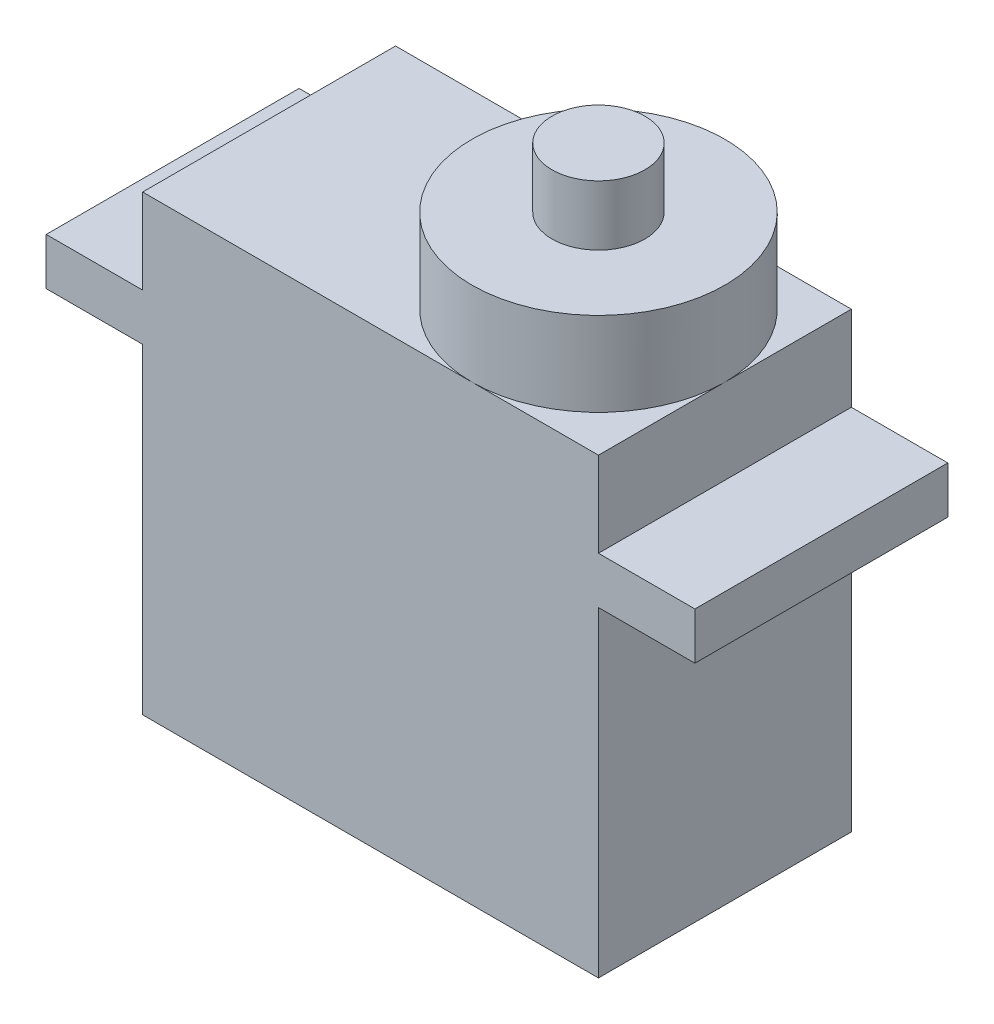
ISO-10303-21;
HEADER;
FILE_DESCRIPTION(('STEP AP214'),'2;1');
FILE_NAME('part.step','',(''),(''),'','','');
FILE_SCHEMA(('AUTOMOTIVE_DESIGN { 1 0 10303 214 1 1 1 1 }'));
ENDSEC;
DATA;
#1=APPLICATION_CONTEXT('core data for automotive mechanical design processes');
#2=APPLICATION_PROTOCOL_DEFINITION('international standard','automotive_design',2000,#1);
#3=PRODUCT_CONTEXT('',#1,'mechanical');
#4=PRODUCT('Part','Part','',(#3));
#5=PRODUCT_RELATED_PRODUCT_CATEGORY('part','',(#4));
#6=PRODUCT_DEFINITION_FORMATION('','',#4);
#7=PRODUCT_DEFINITION_CONTEXT('part definition',#1,'design');
#8=PRODUCT_DEFINITION('design','',#6,#7);
#9=PRODUCT_DEFINITION_SHAPE('','',#8);
#10=(LENGTH_UNIT() NAMED_UNIT(*) SI_UNIT(.MILLI.,.METRE.));
#11=(NAMED_UNIT(*) PLANE_ANGLE_UNIT() SI_UNIT($,.RADIAN.));
#12=(NAMED_UNIT(*) SI_UNIT($,.STERADIAN.) SOLID_ANGLE_UNIT());
#13=UNCERTAINTY_MEASURE_WITH_UNIT(LENGTH_MEASURE(1.E-05),#10,'distance_accuracy_value','');
#14=(GEOMETRIC_REPRESENTATION_CONTEXT(3) GLOBAL_UNCERTAINTY_ASSIGNED_CONTEXT((#13)) GLOBAL_UNIT_ASSIGNED_CONTEXT((#10,
#11,#12)) REPRESENTATION_CONTEXT('',''));
#15=CARTESIAN_POINT('',(0.,0.,0.));
#16=DIRECTION('',(0.,0.,1.));
#17=DIRECTION('',(1.,0.,0.));
#18=AXIS2_PLACEMENT_3D('',#15,#16,#17);
#19=CARTESIAN_POINT('',(0.,6.6,0.));
#20=DIRECTION('',(0.,1.,0.));
#21=DIRECTION('',(0.,0.,1.));
#22=AXIS2_PLACEMENT_3D('',#19,#20,#21);
#23=PLANE('',#22);
#24=DIRECTION('',(1.,0.,0.));
#25=VECTOR('',#24,1.);
#26=CARTESIAN_POINT('',(0.,6.6,6.325));
#27=LINE('',#26,#25);
#28=CARTESIAN_POINT('',(-11.4,6.6,6.325));
#29=VERTEX_POINT('',#28);
#30=CARTESIAN_POINT('',(5.075,6.6,6.325));
#31=VERTEX_POINT('',#30);
#32=EDGE_CURVE('E172',#29,#31,#27,.T.);
#33=ORIENTED_EDGE('',*,*,#32,.T.);
#34=CARTESIAN_POINT('',(5.075,6.6,0.));
#35=DIRECTION('',(0.,1.,0.));
#36=DIRECTION('',(0.,0.,1.));
#37=AXIS2_PLACEMENT_3D('',#34,#35,#36);
#38=CIRCLE('',#37,6.325);
#39=CARTESIAN_POINT('',(5.075,6.6,-6.32500000000001));
#40=VERTEX_POINT('',#39);
#41=EDGE_CURVE('E11',#31,#40,#38,.F.);
#42=ORIENTED_EDGE('',*,*,#41,.T.);
#43=DIRECTION('',(1.,0.,0.));
#44=VECTOR('',#43,1.);
#45=CARTESIAN_POINT('',(0.,6.6,-6.325));
#46=LINE('',#45,#44);
#47=CARTESIAN_POINT('',(-11.4,6.6,-6.325));
#48=VERTEX_POINT('',#47);
#49=EDGE_CURVE('E178',#48,#40,#46,.T.);
#50=ORIENTED_EDGE('',*,*,#49,.F.);
#51=DIRECTION('',(0.,0.,-1.));
#52=VECTOR('',#51,1.);
#53=CARTESIAN_POINT('',(-11.4,6.6,0.));
#54=LINE('',#53,#52);
#55=EDGE_CURVE('E184',#29,#48,#54,.T.);
#56=ORIENTED_EDGE('',*,*,#55,.F.);
#57=EDGE_LOOP('',(#33,#42,#50,#56));
#58=FACE_BOUND('',#57,.T.);
#59=ADVANCED_FACE('F44',(#58),#23,.T.);
#60=CARTESIAN_POINT('',(11.4,6.6,-6.32500000000001));
#61=VERTEX_POINT('',#60);
#62=EDGE_CURVE('E159',#40,#61,#46,.T.);
#63=ORIENTED_EDGE('',*,*,#62,.F.);
#64=CARTESIAN_POINT('',(11.4,6.6,0.));
#65=VERTEX_POINT('',#64);
#66=EDGE_CURVE('E54',#40,#65,#38,.F.);
#67=ORIENTED_EDGE('',*,*,#66,.T.);
#68=DIRECTION('',(0.,0.,-1.));
#69=VECTOR('',#68,1.);
#70=CARTESIAN_POINT('',(11.4,6.6,0.));
#71=LINE('',#70,#69);
#72=EDGE_CURVE('E157',#65,#61,#71,.T.);
#73=ORIENTED_EDGE('',*,*,#72,.T.);
#74=EDGE_LOOP('',(#63,#67,#73));
#75=FACE_BOUND('',#74,.T.);
#76=ADVANCED_FACE('F156',(#75),#23,.T.);
#77=CARTESIAN_POINT('',(0.,2.35,0.));
#78=DIRECTION('',(0.,1.,0.));
#79=DIRECTION('',(0.,0.,1.));
#80=AXIS2_PLACEMENT_3D('',#77,#78,#79);
#81=PLANE('',#80);
#82=DIRECTION('',(1.,0.,0.));
#83=VECTOR('',#82,1.);
#84=CARTESIAN_POINT('',(0.,2.35,-6.325));
#85=LINE('',#84,#83);
#86=CARTESIAN_POINT('',(11.4,2.35,-6.325));
#87=VERTEX_POINT('',#86);
#88=CARTESIAN_POINT('',(16.225,2.35,-6.325));
#89=VERTEX_POINT('',#88);
#90=EDGE_CURVE('E210',#87,#89,#85,.T.);
#91=ORIENTED_EDGE('',*,*,#90,.F.);
#92=DIRECTION('',(0.,0.,1.));
#93=VECTOR('',#92,1.);
#94=CARTESIAN_POINT('',(11.4,2.35,0.));
#95=LINE('',#94,#93);
#96=CARTESIAN_POINT('',(11.4,2.35,6.325));
#97=VERTEX_POINT('',#96);
#98=EDGE_CURVE('E151',#87,#97,#95,.T.);
#99=ORIENTED_EDGE('',*,*,#98,.T.);
#100=DIRECTION('',(1.,0.,0.));
#101=VECTOR('',#100,1.);
#102=CARTESIAN_POINT('',(0.,2.35,6.325));
#103=LINE('',#102,#101);
#104=CARTESIAN_POINT('',(16.225,2.35,6.325));
#105=VERTEX_POINT('',#104);
#106=EDGE_CURVE('E220',#97,#105,#103,.T.);
#107=ORIENTED_EDGE('',*,*,#106,.T.);
#108=DIRECTION('',(0.,0.,-1.));
#109=VECTOR('',#108,1.);
#110=CARTESIAN_POINT('',(16.225,2.35,0.));
#111=LINE('',#110,#109);
#112=EDGE_CURVE('E206',#105,#89,#111,.T.);
#113=ORIENTED_EDGE('',*,*,#112,.T.);
#114=EDGE_LOOP('',(#91,#99,#107,#113));
#115=FACE_BOUND('',#114,.T.);
#116=ADVANCED_FACE('F292',(#115),#81,.T.);
#117=CARTESIAN_POINT('',(0.,-16.05,6.325));
#118=DIRECTION('',(0.,0.,1.));
#119=DIRECTION('',(1.,0.,0.));
#120=AXIS2_PLACEMENT_3D('',#117,#118,#119);
#121=PLANE('',#120);
#122=CARTESIAN_POINT('',(11.4,6.6,6.325));
#123=VERTEX_POINT('',#122);
#124=EDGE_CURVE('E175',#31,#123,#27,.T.);
#125=ORIENTED_EDGE('',*,*,#124,.F.);
#126=ORIENTED_EDGE('',*,*,#32,.F.);
#127=DIRECTION('',(0.,-1.,0.));
#128=VECTOR('',#127,1.);
#129=CARTESIAN_POINT('',(-11.4,6.6,6.325));
#130=LINE('',#129,#128);
#131=CARTESIAN_POINT('',(-11.4,2.35,6.325));
#132=VERTEX_POINT('',#131);
#133=EDGE_CURVE('E188',#29,#132,#130,.T.);
#134=ORIENTED_EDGE('',*,*,#133,.T.);
#135=CARTESIAN_POINT('',(-16.225,2.35,6.325));
#136=VERTEX_POINT('',#135);
#137=EDGE_CURVE('E221',#136,#132,#103,.T.);
#138=ORIENTED_EDGE('',*,*,#137,.F.);
#139=DIRECTION('',(0.,-1.,0.));
#140=VECTOR('',#139,1.);
#141=CARTESIAN_POINT('',(-16.225,2.35,6.325));
#142=LINE('',#141,#140);
#143=CARTESIAN_POINT('',(-16.225,0.,6.325));
#144=VERTEX_POINT('',#143);
#145=EDGE_CURVE('E243',#136,#144,#142,.T.);
#146=ORIENTED_EDGE('',*,*,#145,.T.);
#147=DIRECTION('',(1.,0.,0.));
#148=VECTOR('',#147,1.);
#149=CARTESIAN_POINT('',(0.,0.,6.325));
#150=LINE('',#149,#148);
#151=CARTESIAN_POINT('',(-11.4,0.,6.325));
#152=VERTEX_POINT('',#151);
#153=EDGE_CURVE('E211',#144,#152,#150,.T.);
#154=ORIENTED_EDGE('',*,*,#153,.T.);
#155=DIRECTION('',(0.,1.,0.));
#156=VECTOR('',#155,1.);
#157=CARTESIAN_POINT('',(-11.4,-16.05,6.325));
#158=LINE('',#157,#156);
#159=CARTESIAN_POINT('',(-11.4,-16.05,6.325));
#160=VERTEX_POINT('',#159);
#161=EDGE_CURVE('E275',#160,#152,#158,.T.);
#162=ORIENTED_EDGE('',*,*,#161,.F.);
#163=DIRECTION('',(1.,0.,0.));
#164=VECTOR('',#163,1.);
#165=CARTESIAN_POINT('',(0.,-16.05,6.325));
#166=LINE('',#165,#164);
#167=CARTESIAN_POINT('',(11.4,-16.05,6.325));
#168=VERTEX_POINT('',#167);
#169=EDGE_CURVE('E253',#160,#168,#166,.T.);
#170=ORIENTED_EDGE('',*,*,#169,.T.);
#171=DIRECTION('',(0.,1.,0.));
#172=VECTOR('',#171,1.);
#173=CARTESIAN_POINT('',(11.4,-16.05,6.325));
#174=LINE('',#173,#172);
#175=CARTESIAN_POINT('',(11.4,0.,6.325));
#176=VERTEX_POINT('',#175);
#177=EDGE_CURVE('E268',#168,#176,#174,.T.);
#178=ORIENTED_EDGE('',*,*,#177,.T.);
#179=CARTESIAN_POINT('',(16.225,0.,6.325));
#180=VERTEX_POINT('',#179);
#181=EDGE_CURVE('E236',#176,#180,#150,.T.);
#182=ORIENTED_EDGE('',*,*,#181,.T.);
#183=DIRECTION('',(0.,-1.,0.));
#184=VECTOR('',#183,1.);
#185=CARTESIAN_POINT('',(16.225,2.35,6.325));
#186=LINE('',#185,#184);
#187=EDGE_CURVE('E224',#105,#180,#186,.T.);
#188=ORIENTED_EDGE('',*,*,#187,.F.);
#189=ORIENTED_EDGE('',*,*,#106,.F.);
#190=DIRECTION('',(0.,-1.,0.));
#191=VECTOR('',#190,1.);
#192=CARTESIAN_POINT('',(11.4,6.6,6.325));
#193=LINE('',#192,#191);
#194=EDGE_CURVE('E198',#123,#97,#193,.T.);
#195=ORIENTED_EDGE('',*,*,#194,.F.);
#196=EDGE_LOOP('',(#125,#126,#134,#138,#146,#154,#162,#170,#178,#182,#188,#189,#195));
#197=FACE_BOUND('',#196,.T.);
#198=ADVANCED_FACE('F46',(#197),#121,.T.);
#199=CARTESIAN_POINT('',(-11.4,-16.05,0.));
#200=DIRECTION('',(1.,0.,0.));
#201=DIRECTION('',(0.,0.,-1.));
#202=AXIS2_PLACEMENT_3D('',#199,#200,#201);
#203=PLANE('',#202);
#204=DIRECTION('',(0.,0.,-1.));
#205=VECTOR('',#204,1.);
#206=CARTESIAN_POINT('',(-11.4,0.,0.));
#207=LINE('',#206,#205);
#208=CARTESIAN_POINT('',(-11.4,0.,-6.325));
#209=VERTEX_POINT('',#208);
#210=EDGE_CURVE('E258',#152,#209,#207,.T.);
#211=ORIENTED_EDGE('',*,*,#210,.T.);
#212=DIRECTION('',(0.,1.,0.));
#213=VECTOR('',#212,1.);
#214=CARTESIAN_POINT('',(-11.4,-16.05,-6.325));
#215=LINE('',#214,#213);
#216=CARTESIAN_POINT('',(-11.4,-16.05,-6.325));
#217=VERTEX_POINT('',#216);
#218=EDGE_CURVE('E279',#217,#209,#215,.T.);
#219=ORIENTED_EDGE('',*,*,#218,.F.);
#220=DIRECTION('',(0.,0.,-1.));
#221=VECTOR('',#220,1.);
#222=CARTESIAN_POINT('',(-11.4,-16.05,0.));
#223=LINE('',#222,#221);
#224=EDGE_CURVE('E265',#160,#217,#223,.T.);
#225=ORIENTED_EDGE('',*,*,#224,.F.);
#226=ORIENTED_EDGE('',*,*,#161,.T.);
#227=EDGE_LOOP('',(#211,#219,#225,#226));
#228=FACE_BOUND('',#227,.T.);
#229=ADVANCED_FACE('F360',(#228),#203,.F.);
#230=CARTESIAN_POINT('',(0.,-16.05,-6.325));
#231=DIRECTION('',(0.,0.,1.));
#232=DIRECTION('',(1.,0.,0.));
#233=AXIS2_PLACEMENT_3D('',#230,#231,#232);
#234=PLANE('',#233);
#235=ORIENTED_EDGE('',*,*,#49,.T.);
#236=ORIENTED_EDGE('',*,*,#62,.T.);
#237=DIRECTION('',(0.,-1.,0.));
#238=VECTOR('',#237,1.);
#239=CARTESIAN_POINT('',(11.4,6.6,-6.32500000000001));
#240=LINE('',#239,#238);
#241=EDGE_CURVE('E170',#61,#87,#240,.T.);
#242=ORIENTED_EDGE('',*,*,#241,.T.);
#243=ORIENTED_EDGE('',*,*,#90,.T.);
#244=DIRECTION('',(0.,-1.,0.));
#245=VECTOR('',#244,1.);
#246=CARTESIAN_POINT('',(16.225,2.35,-6.325));
#247=LINE('',#246,#245);
#248=CARTESIAN_POINT('',(16.225,0.,-6.325));
#249=VERTEX_POINT('',#248);
#250=EDGE_CURVE('E249',#89,#249,#247,.T.);
#251=ORIENTED_EDGE('',*,*,#250,.T.);
#252=DIRECTION('',(1.,0.,0.));
#253=VECTOR('',#252,1.);
#254=CARTESIAN_POINT('',(0.,0.,-6.325));
#255=LINE('',#254,#253);
#256=CARTESIAN_POINT('',(11.4,0.,-6.325));
#257=VERTEX_POINT('',#256);
#258=EDGE_CURVE('E228',#257,#249,#255,.T.);
#259=ORIENTED_EDGE('',*,*,#258,.F.);
#260=DIRECTION('',(0.,1.,0.));
#261=VECTOR('',#260,1.);
#262=CARTESIAN_POINT('',(11.4,-16.05,-6.32500000000001));
#263=LINE('',#262,#261);
#264=CARTESIAN_POINT('',(11.4,-16.05,-6.32500000000001));
#265=VERTEX_POINT('',#264);
#266=EDGE_CURVE('E283',#265,#257,#263,.T.);
#267=ORIENTED_EDGE('',*,*,#266,.F.);
#268=DIRECTION('',(1.,0.,0.));
#269=VECTOR('',#268,1.);
#270=CARTESIAN_POINT('',(0.,-16.05,-6.325));
#271=LINE('',#270,#269);
#272=EDGE_CURVE('E262',#217,#265,#271,.T.);
#273=ORIENTED_EDGE('',*,*,#272,.F.);
#274=ORIENTED_EDGE('',*,*,#218,.T.);
#275=CARTESIAN_POINT('',(-16.225,0.,-6.325));
#276=VERTEX_POINT('',#275);
#277=EDGE_CURVE('E229',#276,#209,#255,.T.);
#278=ORIENTED_EDGE('',*,*,#277,.F.);
#279=DIRECTION('',(0.,-1.,0.));
#280=VECTOR('',#279,1.);
#281=CARTESIAN_POINT('',(-16.225,2.35,-6.325));
#282=LINE('',#281,#280);
#283=CARTESIAN_POINT('',(-16.225,2.35,-6.325));
#284=VERTEX_POINT('',#283);
#285=EDGE_CURVE('E246',#284,#276,#282,.T.);
#286=ORIENTED_EDGE('',*,*,#285,.F.);
#287=CARTESIAN_POINT('',(-11.4,2.35,-6.325));
#288=VERTEX_POINT('',#287);
#289=EDGE_CURVE('E212',#284,#288,#85,.T.);
#290=ORIENTED_EDGE('',*,*,#289,.T.);
#291=DIRECTION('',(0.,-1.,0.));
#292=VECTOR('',#291,1.);
#293=CARTESIAN_POINT('',(-11.4,6.6,-6.325));
#294=LINE('',#293,#292);
#295=EDGE_CURVE('E192',#48,#288,#294,.T.);
#296=ORIENTED_EDGE('',*,*,#295,.F.);
#297=EDGE_LOOP('',(#235,#236,#242,#243,#251,#259,#267,#273,#274,#278,#286,#290,#296));
#298=FACE_BOUND('',#297,.T.);
#299=ADVANCED_FACE('F307',(#298),#234,.F.);
#300=CARTESIAN_POINT('',(11.4,-16.05,0.));
#301=DIRECTION('',(1.,0.,0.));
#302=DIRECTION('',(0.,0.,-1.));
#303=AXIS2_PLACEMENT_3D('',#300,#301,#302);
#304=PLANE('',#303);
#305=DIRECTION('',(0.,0.,-1.));
#306=VECTOR('',#305,1.);
#307=CARTESIAN_POINT('',(11.4,0.,0.));
#308=LINE('',#307,#306);
#309=CARTESIAN_POINT('',(11.4,0.,0.));
#310=VERTEX_POINT('',#309);
#311=EDGE_CURVE('E269',#176,#310,#308,.T.);
#312=ORIENTED_EDGE('',*,*,#311,.F.);
#313=ORIENTED_EDGE('',*,*,#177,.F.);
#314=DIRECTION('',(0.,0.,-1.));
#315=VECTOR('',#314,1.);
#316=CARTESIAN_POINT('',(11.4,-16.05,0.));
#317=LINE('',#316,#315);
#318=EDGE_CURVE('E257',#168,#265,#317,.T.);
#319=ORIENTED_EDGE('',*,*,#318,.T.);
#320=ORIENTED_EDGE('',*,*,#266,.T.);
#321=EDGE_CURVE('E62',#310,#257,#308,.T.);
#322=ORIENTED_EDGE('',*,*,#321,.F.);
#323=EDGE_LOOP('',(#312,#313,#319,#320,#322));
#324=FACE_BOUND('',#323,.T.);
#325=ADVANCED_FACE('F365',(#324),#304,.T.);
#326=CARTESIAN_POINT('',(0.,-16.05,0.));
#327=DIRECTION('',(0.,1.,0.));
#328=DIRECTION('',(0.,0.,1.));
#329=AXIS2_PLACEMENT_3D('',#326,#327,#328);
#330=PLANE('',#329);
#331=ORIENTED_EDGE('',*,*,#169,.F.);
#332=ORIENTED_EDGE('',*,*,#224,.T.);
#333=ORIENTED_EDGE('',*,*,#272,.T.);
#334=ORIENTED_EDGE('',*,*,#318,.F.);
#335=EDGE_LOOP('',(#331,#332,#333,#334));
#336=FACE_BOUND('',#335,.T.);
#337=ADVANCED_FACE('F321',(#336),#330,.F.);
#338=CARTESIAN_POINT('',(0.,0.,0.));
#339=DIRECTION('',(0.,1.,0.));
#340=DIRECTION('',(0.,0.,1.));
#341=AXIS2_PLACEMENT_3D('',#338,#339,#340);
#342=PLANE('',#341);
#343=ORIENTED_EDGE('',*,*,#181,.F.);
#344=ORIENTED_EDGE('',*,*,#311,.T.);
#345=ORIENTED_EDGE('',*,*,#321,.T.);
#346=ORIENTED_EDGE('',*,*,#258,.T.);
#347=DIRECTION('',(0.,0.,-1.));
#348=VECTOR('',#347,1.);
#349=CARTESIAN_POINT('',(16.225,0.,0.));
#350=LINE('',#349,#348);
#351=EDGE_CURVE('E205',#180,#249,#350,.T.);
#352=ORIENTED_EDGE('',*,*,#351,.F.);
#353=EDGE_LOOP('',(#343,#344,#345,#346,#352));
#354=FACE_BOUND('',#353,.T.);
#355=ADVANCED_FACE('F303',(#354),#342,.F.);
#356=CARTESIAN_POINT('',(16.225,2.35,0.));
#357=DIRECTION('',(-1.,0.,0.));
#358=DIRECTION('',(0.,0.,1.));
#359=AXIS2_PLACEMENT_3D('',#356,#357,#358);
#360=PLANE('',#359);
#361=ORIENTED_EDGE('',*,*,#351,.T.);
#362=ORIENTED_EDGE('',*,*,#250,.F.);
#363=ORIENTED_EDGE('',*,*,#112,.F.);
#364=ORIENTED_EDGE('',*,*,#187,.T.);
#365=EDGE_LOOP('',(#361,#362,#363,#364));
#366=FACE_BOUND('',#365,.T.);
#367=ADVANCED_FACE('F309',(#366),#360,.F.);
#368=CARTESIAN_POINT('',(-16.225,2.35,0.));
#369=DIRECTION('',(-1.,0.,0.));
#370=DIRECTION('',(0.,0.,1.));
#371=AXIS2_PLACEMENT_3D('',#368,#369,#370);
#372=PLANE('',#371);
#373=DIRECTION('',(0.,0.,-1.));
#374=VECTOR('',#373,1.);
#375=CARTESIAN_POINT('',(-16.225,0.,0.));
#376=LINE('',#375,#374);
#377=EDGE_CURVE('E232',#144,#276,#376,.T.);
#378=ORIENTED_EDGE('',*,*,#377,.F.);
#379=ORIENTED_EDGE('',*,*,#145,.F.);
#380=DIRECTION('',(0.,0.,-1.));
#381=VECTOR('',#380,1.);
#382=CARTESIAN_POINT('',(-16.225,2.35,0.));
#383=LINE('',#382,#381);
#384=EDGE_CURVE('E216',#136,#284,#383,.T.);
#385=ORIENTED_EDGE('',*,*,#384,.T.);
#386=ORIENTED_EDGE('',*,*,#285,.T.);
#387=EDGE_LOOP('',(#378,#379,#385,#386));
#388=FACE_BOUND('',#387,.T.);
#389=ADVANCED_FACE('F311',(#388),#372,.T.);
#390=DIRECTION('',(0.,0.,1.));
#391=VECTOR('',#390,1.);
#392=CARTESIAN_POINT('',(-11.4,2.35,0.));
#393=LINE('',#392,#391);
#394=EDGE_CURVE('E201',#288,#132,#393,.T.);
#395=ORIENTED_EDGE('',*,*,#394,.F.);
#396=ORIENTED_EDGE('',*,*,#289,.F.);
#397=ORIENTED_EDGE('',*,*,#384,.F.);
#398=ORIENTED_EDGE('',*,*,#137,.T.);
#399=EDGE_LOOP('',(#395,#396,#397,#398));
#400=FACE_BOUND('',#399,.T.);
#401=ADVANCED_FACE('F317',(#400),#81,.T.);
#402=ORIENTED_EDGE('',*,*,#210,.F.);
#403=ORIENTED_EDGE('',*,*,#153,.F.);
#404=ORIENTED_EDGE('',*,*,#377,.T.);
#405=ORIENTED_EDGE('',*,*,#277,.T.);
#406=EDGE_LOOP('',(#402,#403,#404,#405));
#407=FACE_BOUND('',#406,.T.);
#408=ADVANCED_FACE('F323',(#407),#342,.F.);
#409=CARTESIAN_POINT('',(11.4,6.6,0.));
#410=DIRECTION('',(-1.,0.,0.));
#411=DIRECTION('',(0.,0.,1.));
#412=AXIS2_PLACEMENT_3D('',#409,#410,#411);
#413=PLANE('',#412);
#414=ORIENTED_EDGE('',*,*,#194,.T.);
#415=ORIENTED_EDGE('',*,*,#98,.F.);
#416=ORIENTED_EDGE('',*,*,#241,.F.);
#417=ORIENTED_EDGE('',*,*,#72,.F.);
#418=EDGE_CURVE('E166',#123,#65,#71,.T.);
#419=ORIENTED_EDGE('',*,*,#418,.F.);
#420=EDGE_LOOP('',(#414,#415,#416,#417,#419));
#421=FACE_BOUND('',#420,.T.);
#422=ADVANCED_FACE('F165',(#421),#413,.F.);
#423=CARTESIAN_POINT('',(-11.4,6.6,0.));
#424=DIRECTION('',(-1.,0.,0.));
#425=DIRECTION('',(0.,0.,1.));
#426=AXIS2_PLACEMENT_3D('',#423,#424,#425);
#427=PLANE('',#426);
#428=ORIENTED_EDGE('',*,*,#295,.T.);
#429=ORIENTED_EDGE('',*,*,#394,.T.);
#430=ORIENTED_EDGE('',*,*,#133,.F.);
#431=ORIENTED_EDGE('',*,*,#55,.T.);
#432=EDGE_LOOP('',(#428,#429,#430,#431));
#433=FACE_BOUND('',#432,.T.);
#434=ADVANCED_FACE('F336',(#433),#427,.T.);
#435=ORIENTED_EDGE('',*,*,#418,.T.);
#436=EDGE_CURVE('E55',#65,#31,#38,.F.);
#437=ORIENTED_EDGE('',*,*,#436,.T.);
#438=ORIENTED_EDGE('',*,*,#124,.T.);
#439=EDGE_LOOP('',(#435,#437,#438));
#440=FACE_BOUND('',#439,.T.);
#441=ADVANCED_FACE('F174',(#440),#23,.T.);
#442=CARTESIAN_POINT('',(5.075,10.8,0.));
#443=DIRECTION('',(0.,-1.,0.));
#444=DIRECTION('',(0.,0.,-1.));
#445=AXIS2_PLACEMENT_3D('',#442,#443,#444);
#446=CYLINDRICAL_SURFACE('',#445,6.325);
#447=ORIENTED_EDGE('',*,*,#41,.F.);
#448=ORIENTED_EDGE('',*,*,#436,.F.);
#449=ORIENTED_EDGE('',*,*,#66,.F.);
#450=EDGE_LOOP('',(#447,#448,#449));
#451=FACE_BOUND('',#450,.T.);
#452=CARTESIAN_POINT('',(5.075,10.8,0.));
#453=DIRECTION('',(0.,1.,0.));
#454=DIRECTION('',(0.,0.,1.));
#455=AXIS2_PLACEMENT_3D('',#452,#453,#454);
#456=CIRCLE('',#455,6.325);
#457=CARTESIAN_POINT('',(5.075,10.8,6.325));
#458=VERTEX_POINT('',#457);
#459=EDGE_CURVE('E448',#458,#458,#456,.T.);
#460=ORIENTED_EDGE('',*,*,#459,.F.);
#461=EDGE_LOOP('',(#460));
#462=FACE_BOUND('',#461,.T.);
#463=ADVANCED_FACE('F145',(#451,#462),#446,.T.);
#464=CARTESIAN_POINT('',(0.,10.8,0.));
#465=DIRECTION('',(0.,1.,0.));
#466=DIRECTION('',(0.,0.,1.));
#467=AXIS2_PLACEMENT_3D('',#464,#465,#466);
#468=PLANE('',#467);
#469=CARTESIAN_POINT('',(5.075,10.8,0.));
#470=DIRECTION('',(0.,1.,0.));
#471=DIRECTION('',(0.,0.,1.));
#472=AXIS2_PLACEMENT_3D('',#469,#470,#471);
#473=CIRCLE('',#472,2.325);
#474=CARTESIAN_POINT('',(5.075,10.8,-2.325));
#475=VERTEX_POINT('',#474);
#476=EDGE_CURVE('E48',#475,#475,#473,.F.);
#477=ORIENTED_EDGE('',*,*,#476,.T.);
#478=EDGE_LOOP('',(#477));
#479=FACE_BOUND('',#478,.T.);
#480=ORIENTED_EDGE('',*,*,#459,.T.);
#481=EDGE_LOOP('',(#480));
#482=FACE_BOUND('',#481,.T.);
#483=ADVANCED_FACE('F341',(#479,#482),#468,.T.);
#484=CARTESIAN_POINT('',(5.075,13.8,0.));
#485=DIRECTION('',(0.,-1.,0.));
#486=DIRECTION('',(0.,0.,-1.));
#487=AXIS2_PLACEMENT_3D('',#484,#485,#486);
#488=CYLINDRICAL_SURFACE('',#487,2.325);
#489=CARTESIAN_POINT('',(5.075,13.8,0.));
#490=DIRECTION('',(0.,1.,0.));
#491=DIRECTION('',(0.,0.,1.));
#492=AXIS2_PLACEMENT_3D('',#489,#490,#491);
#493=CIRCLE('',#492,2.325);
#494=CARTESIAN_POINT('',(5.075,13.8,-2.325));
#495=VERTEX_POINT('',#494);
#496=EDGE_CURVE('E442',#495,#495,#493,.T.);
#497=CARTESIAN_POINT('',(5.075,10.8,-2.325));
#498=CARTESIAN_POINT('',(5.075,10.83125,-2.325));
#499=CARTESIAN_POINT('',(5.075,10.8625,-2.325));
#500=CARTESIAN_POINT('',(5.075,10.925,-2.325));
#501=CARTESIAN_POINT('',(5.075,10.95625,-2.325));
#502=CARTESIAN_POINT('',(5.075,11.01875,-2.325));
#503=CARTESIAN_POINT('',(5.075,11.05,-2.325));
#504=CARTESIAN_POINT('',(5.075,11.1125,-2.325));
#505=CARTESIAN_POINT('',(5.075,11.14375,-2.325));
#506=CARTESIAN_POINT('',(5.075,11.20625,-2.325));
#507=CARTESIAN_POINT('',(5.075,11.2375,-2.325));
#508=CARTESIAN_POINT('',(5.075,11.3,-2.325));
#509=CARTESIAN_POINT('',(5.075,11.33125,-2.325));
#510=CARTESIAN_POINT('',(5.075,11.39375,-2.325));
#511=CARTESIAN_POINT('',(5.075,11.425,-2.325));
#512=CARTESIAN_POINT('',(5.075,11.4875,-2.325));
#513=CARTESIAN_POINT('',(5.075,11.51875,-2.325));
#514=CARTESIAN_POINT('',(5.075,11.58125,-2.325));
#515=CARTESIAN_POINT('',(5.075,11.6125,-2.325));
#516=CARTESIAN_POINT('',(5.075,11.675,-2.325));
#517=CARTESIAN_POINT('',(5.075,11.70625,-2.325));
#518=CARTESIAN_POINT('',(5.075,11.76875,-2.325));
#519=CARTESIAN_POINT('',(5.075,11.8,-2.325));
#520=CARTESIAN_POINT('',(5.075,11.8625,-2.325));
#521=CARTESIAN_POINT('',(5.075,11.89375,-2.325));
#522=CARTESIAN_POINT('',(5.075,11.95625,-2.325));
#523=CARTESIAN_POINT('',(5.075,11.9875,-2.325));
#524=CARTESIAN_POINT('',(5.075,12.05,-2.325));
#525=CARTESIAN_POINT('',(5.075,12.08125,-2.325));
#526=CARTESIAN_POINT('',(5.075,12.14375,-2.325));
#527=CARTESIAN_POINT('',(5.075,12.175,-2.325));
#528=CARTESIAN_POINT('',(5.075,12.2375,-2.325));
#529=CARTESIAN_POINT('',(5.075,12.26875,-2.325));
#530=CARTESIAN_POINT('',(5.075,12.33125,-2.325));
#531=CARTESIAN_POINT('',(5.075,12.3625,-2.325));
#532=CARTESIAN_POINT('',(5.075,12.425,-2.325));
#533=CARTESIAN_POINT('',(5.075,12.45625,-2.325));
#534=CARTESIAN_POINT('',(5.075,12.51875,-2.325));
#535=CARTESIAN_POINT('',(5.075,12.55,-2.325));
#536=CARTESIAN_POINT('',(5.075,12.6125,-2.325));
#537=CARTESIAN_POINT('',(5.075,12.64375,-2.325));
#538=CARTESIAN_POINT('',(5.075,12.70625,-2.325));
#539=CARTESIAN_POINT('',(5.075,12.7375,-2.325));
#540=CARTESIAN_POINT('',(5.075,12.8,-2.325));
#541=CARTESIAN_POINT('',(5.075,12.83125,-2.325));
#542=CARTESIAN_POINT('',(5.075,12.89375,-2.325));
#543=CARTESIAN_POINT('',(5.075,12.925,-2.325));
#544=CARTESIAN_POINT('',(5.075,12.9875,-2.325));
#545=CARTESIAN_POINT('',(5.075,13.01875,-2.325));
#546=CARTESIAN_POINT('',(5.075,13.08125,-2.325));
#547=CARTESIAN_POINT('',(5.075,13.1125,-2.325));
#548=CARTESIAN_POINT('',(5.075,13.175,-2.325));
#549=CARTESIAN_POINT('',(5.075,13.20625,-2.325));
#550=CARTESIAN_POINT('',(5.075,13.26875,-2.325));
#551=CARTESIAN_POINT('',(5.075,13.3,-2.325));
#552=CARTESIAN_POINT('',(5.075,13.3625,-2.325));
#553=CARTESIAN_POINT('',(5.075,13.39375,-2.325));
#554=CARTESIAN_POINT('',(5.075,13.45625,-2.325));
#555=CARTESIAN_POINT('',(5.075,13.4875,-2.325));
#556=CARTESIAN_POINT('',(5.075,13.55,-2.325));
#557=CARTESIAN_POINT('',(5.075,13.58125,-2.325));
#558=CARTESIAN_POINT('',(5.075,13.64375,-2.325));
#559=CARTESIAN_POINT('',(5.075,13.675,-2.325));
#560=CARTESIAN_POINT('',(5.075,13.7375,-2.325));
#561=CARTESIAN_POINT('',(5.075,13.76875,-2.325));
#562=CARTESIAN_POINT('',(5.075,13.8,-2.325));
#563=B_SPLINE_CURVE_WITH_KNOTS('',3,(#497,#498,#499,#500,#501,#502,#503,#504,#505,#506,#507,
#508,#509,#510,#511,#512,#513,#514,#515,#516,#517,#518,#519,#520,#521,#522,#523,#524,#525,#526,
#527,#528,#529,#530,#531,#532,#533,#534,#535,#536,#537,#538,#539,#540,#541,#542,#543,#544,#545,
#546,#547,#548,#549,#550,#551,#552,#553,#554,#555,#556,#557,#558,#559,#560,#561,#562),
.UNSPECIFIED.,.F.,.F.,(4,2,2,2,2,2,2,2,2,2,2,2,2,2,2,2,2,2,2,2,2,2,2,2,2,2,2,2,2,2,2,2,4),(0.,
0.0937500000000001,0.1875,0.28125,0.375,0.46875,0.5625,0.656250000000001,0.750000000000001,
0.843750000000001,0.937500000000001,1.03125,1.125,1.21875,1.3125,1.40625,1.5,1.59375,1.6875,
1.78125,1.875,1.96875,2.0625,2.15625,2.25,2.34375,2.4375,2.53125,2.625,2.71875,2.8125,2.90625,
3.),.UNSPECIFIED.);
#564=EDGE_CURVE('BSEAM412',#475,#495,#563,.T.);
#565=ORIENTED_EDGE('',*,*,#476,.F.);
#566=ORIENTED_EDGE('',*,*,#496,.F.);
#567=ORIENTED_EDGE('',*,*,#564,.T.);
#568=ORIENTED_EDGE('',*,*,#564,.F.);
#569=EDGE_LOOP('',(#565,#567,#566,#568));
#570=FACE_BOUND('',#569,.T.);
#571=ADVANCED_FACE('F412',(#570),#488,.T.);
#572=CARTESIAN_POINT('',(0.,13.8,0.));
#573=DIRECTION('',(0.,1.,0.));
#574=DIRECTION('',(0.,0.,1.));
#575=AXIS2_PLACEMENT_3D('',#572,#573,#574);
#576=PLANE('',#575);
#577=ORIENTED_EDGE('',*,*,#496,.T.);
#578=EDGE_LOOP('',(#577));
#579=FACE_BOUND('',#578,.T.);
#580=ADVANCED_FACE('F422',(#579),#576,.T.);
#581=CLOSED_SHELL('',(#59,#76,#116,#198,#229,#299,#325,#337,#355,#367,#389,#401,#408,#422,#434,
#441,#463,#483,#571,#580));
#582=MANIFOLD_SOLID_BREP('B2',#581);
#583=ADVANCED_BREP_SHAPE_REPRESENTATION('',(#18,#582),#14);
#584=SHAPE_DEFINITION_REPRESENTATION(#9,#583);
ENDSEC;
END-ISO-10303-21;
